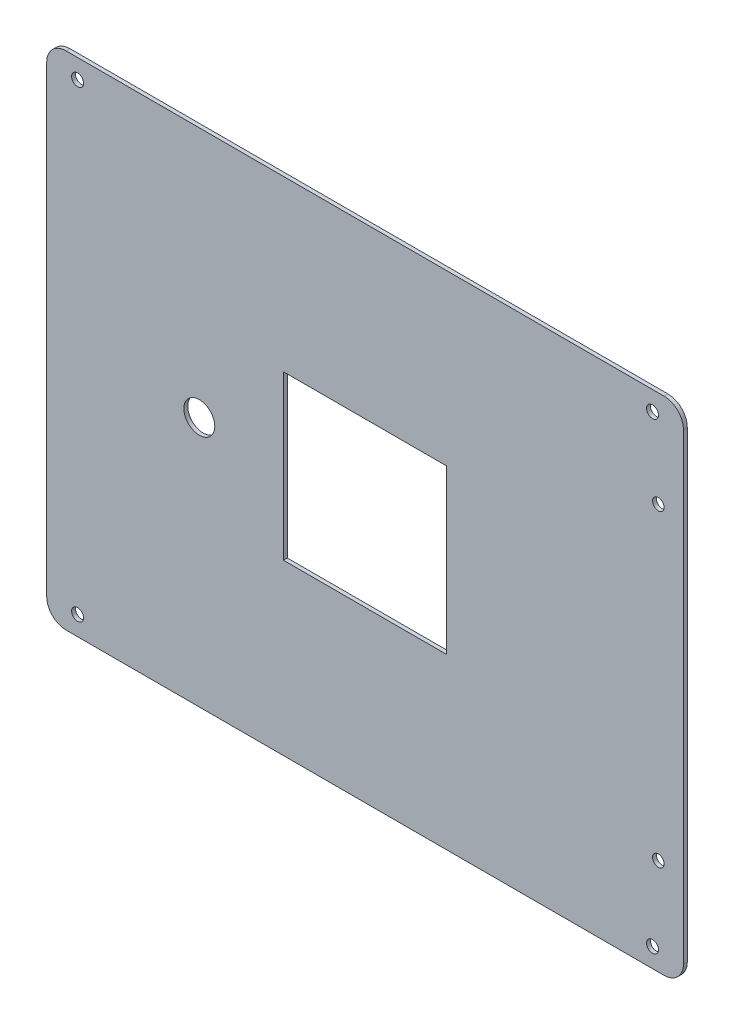
ISO-10303-21;
HEADER;
FILE_DESCRIPTION(('STEP AP214'),'2;1');
FILE_NAME('part.step','',(''),(''),'','','');
FILE_SCHEMA(('AUTOMOTIVE_DESIGN { 1 0 10303 214 1 1 1 1 }'));
ENDSEC;
DATA;
#1=APPLICATION_CONTEXT('core data for automotive mechanical design processes');
#2=APPLICATION_PROTOCOL_DEFINITION('international standard','automotive_design',2000,#1);
#3=PRODUCT_CONTEXT('',#1,'mechanical');
#4=PRODUCT('Part','Part','',(#3));
#5=PRODUCT_RELATED_PRODUCT_CATEGORY('part','',(#4));
#6=PRODUCT_DEFINITION_FORMATION('','',#4);
#7=PRODUCT_DEFINITION_CONTEXT('part definition',#1,'design');
#8=PRODUCT_DEFINITION('design','',#6,#7);
#9=PRODUCT_DEFINITION_SHAPE('','',#8);
#10=(LENGTH_UNIT() NAMED_UNIT(*) SI_UNIT(.MILLI.,.METRE.));
#11=(NAMED_UNIT(*) PLANE_ANGLE_UNIT() SI_UNIT($,.RADIAN.));
#12=(NAMED_UNIT(*) SI_UNIT($,.STERADIAN.) SOLID_ANGLE_UNIT());
#13=UNCERTAINTY_MEASURE_WITH_UNIT(LENGTH_MEASURE(1.E-05),#10,'distance_accuracy_value','');
#14=(GEOMETRIC_REPRESENTATION_CONTEXT(3) GLOBAL_UNCERTAINTY_ASSIGNED_CONTEXT((#13)) GLOBAL_UNIT_ASSIGNED_CONTEXT((#10,
#11,#12)) REPRESENTATION_CONTEXT('',''));
#15=CARTESIAN_POINT('',(0.,0.,0.));
#16=DIRECTION('',(0.,0.,1.));
#17=DIRECTION('',(1.,0.,0.));
#18=AXIS2_PLACEMENT_3D('',#15,#16,#17);
#19=CARTESIAN_POINT('',(77.5,60.,1.));
#20=DIRECTION('',(0.,0.,-1.));
#21=DIRECTION('',(-1.,0.,0.));
#22=AXIS2_PLACEMENT_3D('',#19,#20,#21);
#23=PLANE('',#22);
#24=DIRECTION('',(-1.,0.,0.));
#25=VECTOR('',#24,1.);
#26=CARTESIAN_POINT('',(-21.15,21.15,1.));
#27=LINE('',#26,#25);
#28=CARTESIAN_POINT('',(21.15,21.15,1.));
#29=VERTEX_POINT('',#28);
#30=CARTESIAN_POINT('',(-21.15,21.15,1.));
#31=VERTEX_POINT('',#30);
#32=EDGE_CURVE('E134',#29,#31,#27,.T.);
#33=ORIENTED_EDGE('',*,*,#32,.F.);
#34=DIRECTION('',(0.,1.,0.));
#35=VECTOR('',#34,1.);
#36=CARTESIAN_POINT('',(21.15,21.15,1.));
#37=LINE('',#36,#35);
#38=CARTESIAN_POINT('',(21.15,-21.15,1.));
#39=VERTEX_POINT('',#38);
#40=EDGE_CURVE('E49',#39,#29,#37,.T.);
#41=ORIENTED_EDGE('',*,*,#40,.F.);
#42=DIRECTION('',(1.,0.,0.));
#43=VECTOR('',#42,1.);
#44=CARTESIAN_POINT('',(-21.15,-21.15,1.));
#45=LINE('',#44,#43);
#46=CARTESIAN_POINT('',(-21.15,-21.15,1.));
#47=VERTEX_POINT('',#46);
#48=EDGE_CURVE('E140',#47,#39,#45,.T.);
#49=ORIENTED_EDGE('',*,*,#48,.F.);
#50=DIRECTION('',(0.,-1.,0.));
#51=VECTOR('',#50,1.);
#52=CARTESIAN_POINT('',(-21.15,21.15,1.));
#53=LINE('',#52,#51);
#54=EDGE_CURVE('E125',#31,#47,#53,.T.);
#55=ORIENTED_EDGE('',*,*,#54,.F.);
#56=EDGE_LOOP('',(#33,#41,#49,#55));
#57=FACE_BOUND('',#56,.T.);
#58=CARTESIAN_POINT('',(-42.9511528450248,0.,1.));
#59=DIRECTION('',(0.,0.,1.));
#60=DIRECTION('',(1.,0.,0.));
#61=AXIS2_PLACEMENT_3D('',#58,#59,#60);
#62=CIRCLE('',#61,4.00000000000001);
#63=CARTESIAN_POINT('',(-38.9511528450248,0.,1.));
#64=VERTEX_POINT('',#63);
#65=EDGE_CURVE('E147',#64,#64,#62,.T.);
#66=ORIENTED_EDGE('',*,*,#65,.F.);
#67=EDGE_LOOP('',(#66));
#68=FACE_BOUND('',#67,.T.);
#69=CARTESIAN_POINT('',(76.,40.,1.));
#70=DIRECTION('',(0.,0.,1.));
#71=DIRECTION('',(1.,0.,0.));
#72=AXIS2_PLACEMENT_3D('',#69,#70,#71);
#73=CIRCLE('',#72,1.5);
#74=CARTESIAN_POINT('',(77.5,40.,1.));
#75=VERTEX_POINT('',#74);
#76=EDGE_CURVE('E153',#75,#75,#73,.T.);
#77=ORIENTED_EDGE('',*,*,#76,.F.);
#78=EDGE_LOOP('',(#77));
#79=FACE_BOUND('',#78,.T.);
#80=CARTESIAN_POINT('',(76.,-40.,1.));
#81=DIRECTION('',(0.,0.,1.));
#82=DIRECTION('',(1.,0.,0.));
#83=AXIS2_PLACEMENT_3D('',#80,#81,#82);
#84=CIRCLE('',#83,1.5);
#85=CARTESIAN_POINT('',(77.5,-40.,1.));
#86=VERTEX_POINT('',#85);
#87=EDGE_CURVE('E157',#86,#86,#84,.T.);
#88=ORIENTED_EDGE('',*,*,#87,.F.);
#89=EDGE_LOOP('',(#88));
#90=FACE_BOUND('',#89,.T.);
#91=CARTESIAN_POINT('',(77.5,60.,1.));
#92=DIRECTION('',(0.,0.,1.));
#93=DIRECTION('',(-1.,0.,0.));
#94=AXIS2_PLACEMENT_3D('',#91,#92,#93);
#95=CIRCLE('',#94,5.);
#96=CARTESIAN_POINT('',(82.5,60.,1.));
#97=VERTEX_POINT('',#96);
#98=CARTESIAN_POINT('',(77.5,65.,1.));
#99=VERTEX_POINT('',#98);
#100=EDGE_CURVE('E186',#97,#99,#95,.T.);
#101=ORIENTED_EDGE('',*,*,#100,.T.);
#102=DIRECTION('',(-1.,0.,0.));
#103=VECTOR('',#102,1.);
#104=CARTESIAN_POINT('',(-77.5,65.,1.));
#105=LINE('',#104,#103);
#106=CARTESIAN_POINT('',(-77.5,65.,1.));
#107=VERTEX_POINT('',#106);
#108=EDGE_CURVE('E189',#99,#107,#105,.T.);
#109=ORIENTED_EDGE('',*,*,#108,.T.);
#110=CARTESIAN_POINT('',(-77.5,60.,1.));
#111=DIRECTION('',(0.,0.,1.));
#112=DIRECTION('',(1.,0.,0.));
#113=AXIS2_PLACEMENT_3D('',#110,#111,#112);
#114=CIRCLE('',#113,5.);
#115=CARTESIAN_POINT('',(-82.5,60.,1.));
#116=VERTEX_POINT('',#115);
#117=EDGE_CURVE('E192',#107,#116,#114,.T.);
#118=ORIENTED_EDGE('',*,*,#117,.T.);
#119=DIRECTION('',(0.,-1.,0.));
#120=VECTOR('',#119,1.);
#121=CARTESIAN_POINT('',(-82.5,60.,1.));
#122=LINE('',#121,#120);
#123=CARTESIAN_POINT('',(-82.5,-59.9999999999999,1.));
#124=VERTEX_POINT('',#123);
#125=EDGE_CURVE('E194',#116,#124,#122,.T.);
#126=ORIENTED_EDGE('',*,*,#125,.T.);
#127=CARTESIAN_POINT('',(-77.5,-60.,1.));
#128=DIRECTION('',(0.,0.,1.));
#129=DIRECTION('',(1.,0.,0.));
#130=AXIS2_PLACEMENT_3D('',#127,#128,#129);
#131=CIRCLE('',#130,5.);
#132=CARTESIAN_POINT('',(-77.5,-65.,1.));
#133=VERTEX_POINT('',#132);
#134=EDGE_CURVE('E196',#124,#133,#131,.T.);
#135=ORIENTED_EDGE('',*,*,#134,.T.);
#136=DIRECTION('',(1.,0.,0.));
#137=VECTOR('',#136,1.);
#138=CARTESIAN_POINT('',(-77.5,-65.,1.));
#139=LINE('',#138,#137);
#140=CARTESIAN_POINT('',(77.5,-65.,1.));
#141=VERTEX_POINT('',#140);
#142=EDGE_CURVE('E198',#133,#141,#139,.T.);
#143=ORIENTED_EDGE('',*,*,#142,.T.);
#144=CARTESIAN_POINT('',(77.5,-60.,1.));
#145=DIRECTION('',(0.,0.,1.));
#146=DIRECTION('',(1.,0.,0.));
#147=AXIS2_PLACEMENT_3D('',#144,#145,#146);
#148=CIRCLE('',#147,5.);
#149=CARTESIAN_POINT('',(82.5,-60.,1.));
#150=VERTEX_POINT('',#149);
#151=EDGE_CURVE('E200',#141,#150,#148,.T.);
#152=ORIENTED_EDGE('',*,*,#151,.T.);
#153=DIRECTION('',(0.,1.,0.));
#154=VECTOR('',#153,1.);
#155=CARTESIAN_POINT('',(82.5,60.,1.));
#156=LINE('',#155,#154);
#157=EDGE_CURVE('E202',#150,#97,#156,.T.);
#158=ORIENTED_EDGE('',*,*,#157,.T.);
#159=EDGE_LOOP('',(#101,#109,#118,#126,#135,#143,#152,#158));
#160=FACE_BOUND('',#159,.T.);
#161=CARTESIAN_POINT('',(-74.5,60.,1.));
#162=DIRECTION('',(0.,0.,1.));
#163=DIRECTION('',(1.,0.,0.));
#164=AXIS2_PLACEMENT_3D('',#161,#162,#163);
#165=CIRCLE('',#164,1.54999999999999);
#166=CARTESIAN_POINT('',(-72.95,60.,1.));
#167=VERTEX_POINT('',#166);
#168=EDGE_CURVE('E180',#167,#167,#165,.T.);
#169=ORIENTED_EDGE('',*,*,#168,.F.);
#170=EDGE_LOOP('',(#169));
#171=FACE_BOUND('',#170,.T.);
#172=CARTESIAN_POINT('',(74.5,60.,1.));
#173=DIRECTION('',(0.,0.,1.));
#174=DIRECTION('',(1.,0.,0.));
#175=AXIS2_PLACEMENT_3D('',#172,#173,#174);
#176=CIRCLE('',#175,1.54999999999999);
#177=CARTESIAN_POINT('',(76.05,60.,1.));
#178=VERTEX_POINT('',#177);
#179=EDGE_CURVE('E174',#178,#178,#176,.T.);
#180=ORIENTED_EDGE('',*,*,#179,.F.);
#181=EDGE_LOOP('',(#180));
#182=FACE_BOUND('',#181,.T.);
#183=CARTESIAN_POINT('',(74.5,-60.,1.));
#184=DIRECTION('',(0.,0.,1.));
#185=DIRECTION('',(1.,0.,0.));
#186=AXIS2_PLACEMENT_3D('',#183,#184,#185);
#187=CIRCLE('',#186,1.54999999999999);
#188=CARTESIAN_POINT('',(76.05,-60.,1.));
#189=VERTEX_POINT('',#188);
#190=EDGE_CURVE('E168',#189,#189,#187,.T.);
#191=ORIENTED_EDGE('',*,*,#190,.F.);
#192=EDGE_LOOP('',(#191));
#193=FACE_BOUND('',#192,.T.);
#194=CARTESIAN_POINT('',(-74.5,-60.,1.));
#195=DIRECTION('',(0.,0.,1.));
#196=DIRECTION('',(1.,0.,0.));
#197=AXIS2_PLACEMENT_3D('',#194,#195,#196);
#198=CIRCLE('',#197,1.54999999999999);
#199=CARTESIAN_POINT('',(-72.95,-60.,1.));
#200=VERTEX_POINT('',#199);
#201=EDGE_CURVE('E160',#200,#200,#198,.T.);
#202=ORIENTED_EDGE('',*,*,#201,.F.);
#203=EDGE_LOOP('',(#202));
#204=FACE_BOUND('',#203,.T.);
#205=ADVANCED_FACE('F34',(#57,#68,#79,#90,#160,#171,#182,#193,#204),#23,.F.);
#206=CARTESIAN_POINT('',(77.5,60.,0.));
#207=DIRECTION('',(0.,0.,-1.));
#208=DIRECTION('',(-1.,0.,0.));
#209=AXIS2_PLACEMENT_3D('',#206,#207,#208);
#210=PLANE('',#209);
#211=DIRECTION('',(0.,-1.,0.));
#212=VECTOR('',#211,1.);
#213=CARTESIAN_POINT('',(21.15,60.,0.));
#214=LINE('',#213,#212);
#215=CARTESIAN_POINT('',(21.15,21.15,0.));
#216=VERTEX_POINT('',#215);
#217=CARTESIAN_POINT('',(21.15,-21.15,0.));
#218=VERTEX_POINT('',#217);
#219=EDGE_CURVE('E11',#216,#218,#214,.T.);
#220=ORIENTED_EDGE('',*,*,#219,.F.);
#221=DIRECTION('',(1.,0.,0.));
#222=VECTOR('',#221,1.);
#223=CARTESIAN_POINT('',(77.5,21.15,0.));
#224=LINE('',#223,#222);
#225=CARTESIAN_POINT('',(-21.15,21.15,0.));
#226=VERTEX_POINT('',#225);
#227=EDGE_CURVE('E243',#226,#216,#224,.T.);
#228=ORIENTED_EDGE('',*,*,#227,.F.);
#229=DIRECTION('',(0.,1.,0.));
#230=VECTOR('',#229,1.);
#231=CARTESIAN_POINT('',(-21.15,60.,0.));
#232=LINE('',#231,#230);
#233=CARTESIAN_POINT('',(-21.15,-21.15,0.));
#234=VERTEX_POINT('',#233);
#235=EDGE_CURVE('E128',#234,#226,#232,.T.);
#236=ORIENTED_EDGE('',*,*,#235,.F.);
#237=DIRECTION('',(-1.,0.,0.));
#238=VECTOR('',#237,1.);
#239=CARTESIAN_POINT('',(77.5,-21.15,0.));
#240=LINE('',#239,#238);
#241=EDGE_CURVE('E42',#218,#234,#240,.T.);
#242=ORIENTED_EDGE('',*,*,#241,.F.);
#243=EDGE_LOOP('',(#220,#228,#236,#242));
#244=FACE_BOUND('',#243,.T.);
#245=CARTESIAN_POINT('',(-42.9511528450248,0.,0.));
#246=DIRECTION('',(0.,0.,-1.));
#247=DIRECTION('',(-1.,0.,0.));
#248=AXIS2_PLACEMENT_3D('',#245,#246,#247);
#249=CIRCLE('',#248,4.00000000000001);
#250=CARTESIAN_POINT('',(-46.9511528450248,0.,0.));
#251=VERTEX_POINT('',#250);
#252=EDGE_CURVE('E152',#251,#251,#249,.T.);
#253=ORIENTED_EDGE('',*,*,#252,.F.);
#254=EDGE_LOOP('',(#253));
#255=FACE_BOUND('',#254,.T.);
#256=CARTESIAN_POINT('',(76.,40.,0.));
#257=DIRECTION('',(0.,0.,-1.));
#258=DIRECTION('',(-1.,0.,0.));
#259=AXIS2_PLACEMENT_3D('',#256,#257,#258);
#260=CIRCLE('',#259,1.5);
#261=CARTESIAN_POINT('',(74.5,40.,0.));
#262=VERTEX_POINT('',#261);
#263=EDGE_CURVE('E167',#262,#262,#260,.T.);
#264=ORIENTED_EDGE('',*,*,#263,.F.);
#265=EDGE_LOOP('',(#264));
#266=FACE_BOUND('',#265,.T.);
#267=CARTESIAN_POINT('',(76.,-40.,0.));
#268=DIRECTION('',(0.,0.,-1.));
#269=DIRECTION('',(-1.,0.,0.));
#270=AXIS2_PLACEMENT_3D('',#267,#268,#269);
#271=CIRCLE('',#270,1.5);
#272=CARTESIAN_POINT('',(74.5,-40.,0.));
#273=VERTEX_POINT('',#272);
#274=EDGE_CURVE('E156',#273,#273,#271,.T.);
#275=ORIENTED_EDGE('',*,*,#274,.F.);
#276=EDGE_LOOP('',(#275));
#277=FACE_BOUND('',#276,.T.);
#278=CARTESIAN_POINT('',(74.5,-60.,0.));
#279=DIRECTION('',(0.,0.,1.));
#280=DIRECTION('',(1.,0.,0.));
#281=AXIS2_PLACEMENT_3D('',#278,#279,#280);
#282=CIRCLE('',#281,1.54999999999999);
#283=CARTESIAN_POINT('',(76.05,-60.,0.));
#284=VERTEX_POINT('',#283);
#285=EDGE_CURVE('E163',#284,#284,#282,.T.);
#286=ORIENTED_EDGE('',*,*,#285,.T.);
#287=EDGE_LOOP('',(#286));
#288=FACE_BOUND('',#287,.T.);
#289=CARTESIAN_POINT('',(-74.5,60.,0.));
#290=DIRECTION('',(0.,0.,1.));
#291=DIRECTION('',(1.,0.,0.));
#292=AXIS2_PLACEMENT_3D('',#289,#290,#291);
#293=CIRCLE('',#292,1.54999999999999);
#294=CARTESIAN_POINT('',(-72.95,60.,0.));
#295=VERTEX_POINT('',#294);
#296=EDGE_CURVE('E177',#295,#295,#293,.T.);
#297=ORIENTED_EDGE('',*,*,#296,.T.);
#298=EDGE_LOOP('',(#297));
#299=FACE_BOUND('',#298,.T.);
#300=CARTESIAN_POINT('',(77.5,60.,0.));
#301=DIRECTION('',(0.,0.,1.));
#302=DIRECTION('',(-1.,0.,0.));
#303=AXIS2_PLACEMENT_3D('',#300,#301,#302);
#304=CIRCLE('',#303,5.);
#305=CARTESIAN_POINT('',(82.5,60.,0.));
#306=VERTEX_POINT('',#305);
#307=CARTESIAN_POINT('',(77.5,65.,0.));
#308=VERTEX_POINT('',#307);
#309=EDGE_CURVE('E183',#306,#308,#304,.T.);
#310=ORIENTED_EDGE('',*,*,#309,.F.);
#311=DIRECTION('',(0.,1.,0.));
#312=VECTOR('',#311,1.);
#313=CARTESIAN_POINT('',(82.5,60.,0.));
#314=LINE('',#313,#312);
#315=CARTESIAN_POINT('',(82.5,-60.,0.));
#316=VERTEX_POINT('',#315);
#317=EDGE_CURVE('E190',#316,#306,#314,.T.);
#318=ORIENTED_EDGE('',*,*,#317,.F.);
#319=CARTESIAN_POINT('',(77.5,-60.,0.));
#320=DIRECTION('',(0.,0.,1.));
#321=DIRECTION('',(1.,0.,0.));
#322=AXIS2_PLACEMENT_3D('',#319,#320,#321);
#323=CIRCLE('',#322,5.);
#324=CARTESIAN_POINT('',(77.5,-65.,0.));
#325=VERTEX_POINT('',#324);
#326=EDGE_CURVE('E217',#325,#316,#323,.T.);
#327=ORIENTED_EDGE('',*,*,#326,.F.);
#328=DIRECTION('',(1.,0.,0.));
#329=VECTOR('',#328,1.);
#330=CARTESIAN_POINT('',(-77.5,-65.,0.));
#331=LINE('',#330,#329);
#332=CARTESIAN_POINT('',(-77.5,-65.,0.));
#333=VERTEX_POINT('',#332);
#334=EDGE_CURVE('E215',#333,#325,#331,.T.);
#335=ORIENTED_EDGE('',*,*,#334,.F.);
#336=CARTESIAN_POINT('',(-77.5,-60.,0.));
#337=DIRECTION('',(0.,0.,1.));
#338=DIRECTION('',(1.,0.,0.));
#339=AXIS2_PLACEMENT_3D('',#336,#337,#338);
#340=CIRCLE('',#339,5.);
#341=CARTESIAN_POINT('',(-82.5,-59.9999999999999,0.));
#342=VERTEX_POINT('',#341);
#343=EDGE_CURVE('E213',#342,#333,#340,.T.);
#344=ORIENTED_EDGE('',*,*,#343,.F.);
#345=DIRECTION('',(0.,-1.,0.));
#346=VECTOR('',#345,1.);
#347=CARTESIAN_POINT('',(-82.5,60.,0.));
#348=LINE('',#347,#346);
#349=CARTESIAN_POINT('',(-82.5,60.,0.));
#350=VERTEX_POINT('',#349);
#351=EDGE_CURVE('E211',#350,#342,#348,.T.);
#352=ORIENTED_EDGE('',*,*,#351,.F.);
#353=CARTESIAN_POINT('',(-77.5,60.,0.));
#354=DIRECTION('',(0.,0.,1.));
#355=DIRECTION('',(1.,0.,0.));
#356=AXIS2_PLACEMENT_3D('',#353,#354,#355);
#357=CIRCLE('',#356,5.);
#358=CARTESIAN_POINT('',(-77.5,65.,0.));
#359=VERTEX_POINT('',#358);
#360=EDGE_CURVE('E209',#359,#350,#357,.T.);
#361=ORIENTED_EDGE('',*,*,#360,.F.);
#362=DIRECTION('',(-1.,0.,0.));
#363=VECTOR('',#362,1.);
#364=CARTESIAN_POINT('',(-77.5,65.,0.));
#365=LINE('',#364,#363);
#366=EDGE_CURVE('E207',#308,#359,#365,.T.);
#367=ORIENTED_EDGE('',*,*,#366,.F.);
#368=EDGE_LOOP('',(#310,#318,#327,#335,#344,#352,#361,#367));
#369=FACE_BOUND('',#368,.T.);
#370=CARTESIAN_POINT('',(74.5,60.,0.));
#371=DIRECTION('',(0.,0.,1.));
#372=DIRECTION('',(1.,0.,0.));
#373=AXIS2_PLACEMENT_3D('',#370,#371,#372);
#374=CIRCLE('',#373,1.54999999999999);
#375=CARTESIAN_POINT('',(76.05,60.,0.));
#376=VERTEX_POINT('',#375);
#377=EDGE_CURVE('E171',#376,#376,#374,.T.);
#378=ORIENTED_EDGE('',*,*,#377,.T.);
#379=EDGE_LOOP('',(#378));
#380=FACE_BOUND('',#379,.T.);
#381=CARTESIAN_POINT('',(-74.5,-60.,0.));
#382=DIRECTION('',(0.,0.,1.));
#383=DIRECTION('',(1.,0.,0.));
#384=AXIS2_PLACEMENT_3D('',#381,#382,#383);
#385=CIRCLE('',#384,1.54999999999999);
#386=CARTESIAN_POINT('',(-72.95,-60.,0.));
#387=VERTEX_POINT('',#386);
#388=EDGE_CURVE('E164',#387,#387,#385,.T.);
#389=ORIENTED_EDGE('',*,*,#388,.T.);
#390=EDGE_LOOP('',(#389));
#391=FACE_BOUND('',#390,.T.);
#392=ADVANCED_FACE('F257',(#244,#255,#266,#277,#288,#299,#369,#380,#391),#210,.T.);
#393=CARTESIAN_POINT('',(77.5,60.,1.));
#394=DIRECTION('',(0.,0.,-1.));
#395=DIRECTION('',(-1.,0.,0.));
#396=AXIS2_PLACEMENT_3D('',#393,#394,#395);
#397=CYLINDRICAL_SURFACE('',#396,5.);
#398=ORIENTED_EDGE('',*,*,#309,.T.);
#399=DIRECTION('',(0.,0.,-1.));
#400=VECTOR('',#399,1.);
#401=CARTESIAN_POINT('',(77.5,65.,1.));
#402=LINE('',#401,#400);
#403=EDGE_CURVE('E240',#99,#308,#402,.T.);
#404=ORIENTED_EDGE('',*,*,#403,.F.);
#405=ORIENTED_EDGE('',*,*,#100,.F.);
#406=DIRECTION('',(0.,0.,-1.));
#407=VECTOR('',#406,1.);
#408=CARTESIAN_POINT('',(82.5,60.,1.));
#409=LINE('',#408,#407);
#410=EDGE_CURVE('E204',#97,#306,#409,.T.);
#411=ORIENTED_EDGE('',*,*,#410,.T.);
#412=EDGE_LOOP('',(#398,#404,#405,#411));
#413=FACE_BOUND('',#412,.T.);
#414=ADVANCED_FACE('F36',(#413),#397,.T.);
#415=CARTESIAN_POINT('',(-77.5,65.,1.));
#416=DIRECTION('',(0.,-1.,0.));
#417=DIRECTION('',(0.,0.,-1.));
#418=AXIS2_PLACEMENT_3D('',#415,#416,#417);
#419=PLANE('',#418);
#420=ORIENTED_EDGE('',*,*,#366,.T.);
#421=DIRECTION('',(0.,0.,-1.));
#422=VECTOR('',#421,1.);
#423=CARTESIAN_POINT('',(-77.5,65.,1.));
#424=LINE('',#423,#422);
#425=EDGE_CURVE('E237',#107,#359,#424,.T.);
#426=ORIENTED_EDGE('',*,*,#425,.F.);
#427=ORIENTED_EDGE('',*,*,#108,.F.);
#428=ORIENTED_EDGE('',*,*,#403,.T.);
#429=EDGE_LOOP('',(#420,#426,#427,#428));
#430=FACE_BOUND('',#429,.T.);
#431=ADVANCED_FACE('F305',(#430),#419,.F.);
#432=CARTESIAN_POINT('',(-77.5,60.,1.));
#433=DIRECTION('',(0.,0.,-1.));
#434=DIRECTION('',(-1.,0.,0.));
#435=AXIS2_PLACEMENT_3D('',#432,#433,#434);
#436=CYLINDRICAL_SURFACE('',#435,5.);
#437=ORIENTED_EDGE('',*,*,#360,.T.);
#438=DIRECTION('',(0.,0.,-1.));
#439=VECTOR('',#438,1.);
#440=CARTESIAN_POINT('',(-82.5,60.,1.));
#441=LINE('',#440,#439);
#442=EDGE_CURVE('E234',#116,#350,#441,.T.);
#443=ORIENTED_EDGE('',*,*,#442,.F.);
#444=ORIENTED_EDGE('',*,*,#117,.F.);
#445=ORIENTED_EDGE('',*,*,#425,.T.);
#446=EDGE_LOOP('',(#437,#443,#444,#445));
#447=FACE_BOUND('',#446,.T.);
#448=ADVANCED_FACE('F302',(#447),#436,.T.);
#449=CARTESIAN_POINT('',(-82.5,60.,1.));
#450=DIRECTION('',(1.,0.,0.));
#451=DIRECTION('',(0.,0.,-1.));
#452=AXIS2_PLACEMENT_3D('',#449,#450,#451);
#453=PLANE('',#452);
#454=ORIENTED_EDGE('',*,*,#351,.T.);
#455=DIRECTION('',(0.,0.,-1.));
#456=VECTOR('',#455,1.);
#457=CARTESIAN_POINT('',(-82.5,-59.9999999999999,1.));
#458=LINE('',#457,#456);
#459=EDGE_CURVE('E231',#124,#342,#458,.T.);
#460=ORIENTED_EDGE('',*,*,#459,.F.);
#461=ORIENTED_EDGE('',*,*,#125,.F.);
#462=ORIENTED_EDGE('',*,*,#442,.T.);
#463=EDGE_LOOP('',(#454,#460,#461,#462));
#464=FACE_BOUND('',#463,.T.);
#465=ADVANCED_FACE('F298',(#464),#453,.F.);
#466=CARTESIAN_POINT('',(-77.5,-60.,1.));
#467=DIRECTION('',(0.,0.,-1.));
#468=DIRECTION('',(-1.,0.,0.));
#469=AXIS2_PLACEMENT_3D('',#466,#467,#468);
#470=CYLINDRICAL_SURFACE('',#469,5.);
#471=ORIENTED_EDGE('',*,*,#343,.T.);
#472=DIRECTION('',(0.,0.,-1.));
#473=VECTOR('',#472,1.);
#474=CARTESIAN_POINT('',(-77.5,-65.,1.));
#475=LINE('',#474,#473);
#476=EDGE_CURVE('E228',#133,#333,#475,.T.);
#477=ORIENTED_EDGE('',*,*,#476,.F.);
#478=ORIENTED_EDGE('',*,*,#134,.F.);
#479=ORIENTED_EDGE('',*,*,#459,.T.);
#480=EDGE_LOOP('',(#471,#477,#478,#479));
#481=FACE_BOUND('',#480,.T.);
#482=ADVANCED_FACE('F294',(#481),#470,.T.);
#483=CARTESIAN_POINT('',(-77.5,-65.,1.));
#484=DIRECTION('',(0.,1.,0.));
#485=DIRECTION('',(0.,0.,1.));
#486=AXIS2_PLACEMENT_3D('',#483,#484,#485);
#487=PLANE('',#486);
#488=ORIENTED_EDGE('',*,*,#334,.T.);
#489=DIRECTION('',(0.,0.,-1.));
#490=VECTOR('',#489,1.);
#491=CARTESIAN_POINT('',(77.5,-65.,1.));
#492=LINE('',#491,#490);
#493=EDGE_CURVE('E225',#141,#325,#492,.T.);
#494=ORIENTED_EDGE('',*,*,#493,.F.);
#495=ORIENTED_EDGE('',*,*,#142,.F.);
#496=ORIENTED_EDGE('',*,*,#476,.T.);
#497=EDGE_LOOP('',(#488,#494,#495,#496));
#498=FACE_BOUND('',#497,.T.);
#499=ADVANCED_FACE('F290',(#498),#487,.F.);
#500=CARTESIAN_POINT('',(77.5,-60.,1.));
#501=DIRECTION('',(0.,0.,-1.));
#502=DIRECTION('',(-1.,0.,0.));
#503=AXIS2_PLACEMENT_3D('',#500,#501,#502);
#504=CYLINDRICAL_SURFACE('',#503,5.);
#505=ORIENTED_EDGE('',*,*,#326,.T.);
#506=DIRECTION('',(0.,0.,-1.));
#507=VECTOR('',#506,1.);
#508=CARTESIAN_POINT('',(82.5,-60.,1.));
#509=LINE('',#508,#507);
#510=EDGE_CURVE('E222',#150,#316,#509,.T.);
#511=ORIENTED_EDGE('',*,*,#510,.F.);
#512=ORIENTED_EDGE('',*,*,#151,.F.);
#513=ORIENTED_EDGE('',*,*,#493,.T.);
#514=EDGE_LOOP('',(#505,#511,#512,#513));
#515=FACE_BOUND('',#514,.T.);
#516=ADVANCED_FACE('F286',(#515),#504,.T.);
#517=CARTESIAN_POINT('',(82.5,60.,1.));
#518=DIRECTION('',(-1.,0.,0.));
#519=DIRECTION('',(0.,0.,1.));
#520=AXIS2_PLACEMENT_3D('',#517,#518,#519);
#521=PLANE('',#520);
#522=ORIENTED_EDGE('',*,*,#317,.T.);
#523=ORIENTED_EDGE('',*,*,#410,.F.);
#524=ORIENTED_EDGE('',*,*,#157,.F.);
#525=ORIENTED_EDGE('',*,*,#510,.T.);
#526=EDGE_LOOP('',(#522,#523,#524,#525));
#527=FACE_BOUND('',#526,.T.);
#528=ADVANCED_FACE('F283',(#527),#521,.F.);
#529=CARTESIAN_POINT('',(-74.5,60.,1.));
#530=DIRECTION('',(0.,0.,-1.));
#531=DIRECTION('',(-1.,0.,0.));
#532=AXIS2_PLACEMENT_3D('',#529,#530,#531);
#533=CYLINDRICAL_SURFACE('',#532,1.54999999999999);
#534=ORIENTED_EDGE('',*,*,#168,.T.);
#535=EDGE_LOOP('',(#534));
#536=FACE_BOUND('',#535,.T.);
#537=ORIENTED_EDGE('',*,*,#296,.F.);
#538=EDGE_LOOP('',(#537));
#539=FACE_BOUND('',#538,.T.);
#540=ADVANCED_FACE('F280',(#536,#539),#533,.F.);
#541=CARTESIAN_POINT('',(74.5,60.,1.));
#542=DIRECTION('',(0.,0.,-1.));
#543=DIRECTION('',(-1.,0.,0.));
#544=AXIS2_PLACEMENT_3D('',#541,#542,#543);
#545=CYLINDRICAL_SURFACE('',#544,1.54999999999999);
#546=ORIENTED_EDGE('',*,*,#179,.T.);
#547=EDGE_LOOP('',(#546));
#548=FACE_BOUND('',#547,.T.);
#549=ORIENTED_EDGE('',*,*,#377,.F.);
#550=EDGE_LOOP('',(#549));
#551=FACE_BOUND('',#550,.T.);
#552=ADVANCED_FACE('F361',(#548,#551),#545,.F.);
#553=CARTESIAN_POINT('',(74.5,-60.,1.));
#554=DIRECTION('',(0.,0.,-1.));
#555=DIRECTION('',(-1.,0.,0.));
#556=AXIS2_PLACEMENT_3D('',#553,#554,#555);
#557=CYLINDRICAL_SURFACE('',#556,1.54999999999999);
#558=ORIENTED_EDGE('',*,*,#190,.T.);
#559=EDGE_LOOP('',(#558));
#560=FACE_BOUND('',#559,.T.);
#561=ORIENTED_EDGE('',*,*,#285,.F.);
#562=EDGE_LOOP('',(#561));
#563=FACE_BOUND('',#562,.T.);
#564=ADVANCED_FACE('F351',(#560,#563),#557,.F.);
#565=CARTESIAN_POINT('',(-74.5,-60.,1.));
#566=DIRECTION('',(0.,0.,-1.));
#567=DIRECTION('',(-1.,0.,0.));
#568=AXIS2_PLACEMENT_3D('',#565,#566,#567);
#569=CYLINDRICAL_SURFACE('',#568,1.54999999999999);
#570=ORIENTED_EDGE('',*,*,#201,.T.);
#571=EDGE_LOOP('',(#570));
#572=FACE_BOUND('',#571,.T.);
#573=ORIENTED_EDGE('',*,*,#388,.F.);
#574=EDGE_LOOP('',(#573));
#575=FACE_BOUND('',#574,.T.);
#576=ADVANCED_FACE('F347',(#572,#575),#569,.F.);
#577=CARTESIAN_POINT('',(76.,-40.,-9.));
#578=DIRECTION('',(0.,0.,1.));
#579=DIRECTION('',(1.,0.,0.));
#580=AXIS2_PLACEMENT_3D('',#577,#578,#579);
#581=CYLINDRICAL_SURFACE('',#580,1.5);
#582=ORIENTED_EDGE('',*,*,#274,.T.);
#583=EDGE_LOOP('',(#582));
#584=FACE_BOUND('',#583,.T.);
#585=ORIENTED_EDGE('',*,*,#87,.T.);
#586=EDGE_LOOP('',(#585));
#587=FACE_BOUND('',#586,.T.);
#588=ADVANCED_FACE('F350',(#584,#587),#581,.F.);
#589=CARTESIAN_POINT('',(76.,40.,-9.));
#590=DIRECTION('',(0.,0.,1.));
#591=DIRECTION('',(1.,0.,0.));
#592=AXIS2_PLACEMENT_3D('',#589,#590,#591);
#593=CYLINDRICAL_SURFACE('',#592,1.5);
#594=ORIENTED_EDGE('',*,*,#263,.T.);
#595=EDGE_LOOP('',(#594));
#596=FACE_BOUND('',#595,.T.);
#597=ORIENTED_EDGE('',*,*,#76,.T.);
#598=EDGE_LOOP('',(#597));
#599=FACE_BOUND('',#598,.T.);
#600=ADVANCED_FACE('F268',(#596,#599),#593,.F.);
#601=CARTESIAN_POINT('',(-42.9511528450248,0.,-9.));
#602=DIRECTION('',(0.,0.,1.));
#603=DIRECTION('',(1.,0.,0.));
#604=AXIS2_PLACEMENT_3D('',#601,#602,#603);
#605=CYLINDRICAL_SURFACE('',#604,4.00000000000001);
#606=ORIENTED_EDGE('',*,*,#252,.T.);
#607=EDGE_LOOP('',(#606));
#608=FACE_BOUND('',#607,.T.);
#609=ORIENTED_EDGE('',*,*,#65,.T.);
#610=EDGE_LOOP('',(#609));
#611=FACE_BOUND('',#610,.T.);
#612=ADVANCED_FACE('F261',(#608,#611),#605,.F.);
#613=CARTESIAN_POINT('',(21.15,21.15,-9.));
#614=DIRECTION('',(1.,0.,0.));
#615=DIRECTION('',(0.,1.,0.));
#616=AXIS2_PLACEMENT_3D('',#613,#614,#615);
#617=PLANE('',#616);
#618=ORIENTED_EDGE('',*,*,#219,.T.);
#619=DIRECTION('',(0.,0.,1.));
#620=VECTOR('',#619,1.);
#621=CARTESIAN_POINT('',(21.15,-21.15,-9.));
#622=LINE('',#621,#620);
#623=EDGE_CURVE('E145',#218,#39,#622,.T.);
#624=ORIENTED_EDGE('',*,*,#623,.T.);
#625=ORIENTED_EDGE('',*,*,#40,.T.);
#626=DIRECTION('',(0.,0.,1.));
#627=VECTOR('',#626,1.);
#628=CARTESIAN_POINT('',(21.15,21.15,-9.));
#629=LINE('',#628,#627);
#630=EDGE_CURVE('E131',#216,#29,#629,.T.);
#631=ORIENTED_EDGE('',*,*,#630,.F.);
#632=EDGE_LOOP('',(#618,#624,#625,#631));
#633=FACE_BOUND('',#632,.T.);
#634=ADVANCED_FACE('F259',(#633),#617,.F.);
#635=CARTESIAN_POINT('',(-21.15,-21.15,-9.));
#636=DIRECTION('',(0.,-1.,0.));
#637=DIRECTION('',(0.,0.,-1.));
#638=AXIS2_PLACEMENT_3D('',#635,#636,#637);
#639=PLANE('',#638);
#640=ORIENTED_EDGE('',*,*,#241,.T.);
#641=DIRECTION('',(0.,0.,1.));
#642=VECTOR('',#641,1.);
#643=CARTESIAN_POINT('',(-21.15,-21.15,-9.));
#644=LINE('',#643,#642);
#645=EDGE_CURVE('E130',#234,#47,#644,.T.);
#646=ORIENTED_EDGE('',*,*,#645,.T.);
#647=ORIENTED_EDGE('',*,*,#48,.T.);
#648=ORIENTED_EDGE('',*,*,#623,.F.);
#649=EDGE_LOOP('',(#640,#646,#647,#648));
#650=FACE_BOUND('',#649,.T.);
#651=ADVANCED_FACE('F254',(#650),#639,.F.);
#652=CARTESIAN_POINT('',(-21.15,21.15,-9.));
#653=DIRECTION('',(-1.,0.,0.));
#654=DIRECTION('',(0.,-1.,0.));
#655=AXIS2_PLACEMENT_3D('',#652,#653,#654);
#656=PLANE('',#655);
#657=ORIENTED_EDGE('',*,*,#235,.T.);
#658=DIRECTION('',(0.,0.,1.));
#659=VECTOR('',#658,1.);
#660=CARTESIAN_POINT('',(-21.15,21.15,-9.));
#661=LINE('',#660,#659);
#662=EDGE_CURVE('E57',#226,#31,#661,.T.);
#663=ORIENTED_EDGE('',*,*,#662,.T.);
#664=ORIENTED_EDGE('',*,*,#54,.T.);
#665=ORIENTED_EDGE('',*,*,#645,.F.);
#666=EDGE_LOOP('',(#657,#663,#664,#665));
#667=FACE_BOUND('',#666,.T.);
#668=ADVANCED_FACE('F122',(#667),#656,.F.);
#669=CARTESIAN_POINT('',(-21.15,21.15,-9.));
#670=DIRECTION('',(0.,1.,0.));
#671=DIRECTION('',(0.,0.,1.));
#672=AXIS2_PLACEMENT_3D('',#669,#670,#671);
#673=PLANE('',#672);
#674=ORIENTED_EDGE('',*,*,#227,.T.);
#675=ORIENTED_EDGE('',*,*,#630,.T.);
#676=ORIENTED_EDGE('',*,*,#32,.T.);
#677=ORIENTED_EDGE('',*,*,#662,.F.);
#678=EDGE_LOOP('',(#674,#675,#676,#677));
#679=FACE_BOUND('',#678,.T.);
#680=ADVANCED_FACE('F135',(#679),#673,.F.);
#681=CLOSED_SHELL('',(#205,#392,#414,#431,#448,#465,#482,#499,#516,#528,#540,#552,#564,#576,
#588,#600,#612,#634,#651,#668,#680));
#682=MANIFOLD_SOLID_BREP('B2',#681);
#683=ADVANCED_BREP_SHAPE_REPRESENTATION('',(#18,#682),#14);
#684=SHAPE_DEFINITION_REPRESENTATION(#9,#683);
ENDSEC;
END-ISO-10303-21;
